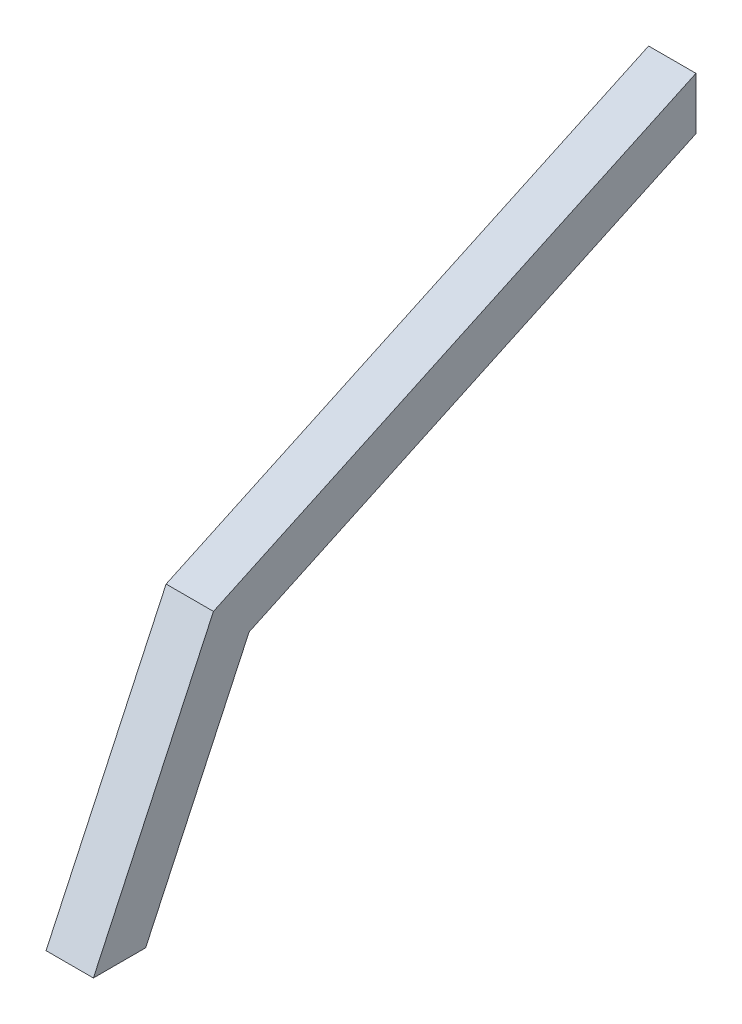
ISO-10303-21;
HEADER;
FILE_DESCRIPTION(('STEP AP214'),'2;1');
FILE_NAME('part.step','',(''),(''),'','','');
FILE_SCHEMA(('AUTOMOTIVE_DESIGN { 1 0 10303 214 1 1 1 1 }'));
ENDSEC;
DATA;
#1=APPLICATION_CONTEXT('core data for automotive mechanical design processes');
#2=APPLICATION_PROTOCOL_DEFINITION('international standard','automotive_design',2000,#1);
#3=PRODUCT_CONTEXT('',#1,'mechanical');
#4=PRODUCT('Part','Part','',(#3));
#5=PRODUCT_RELATED_PRODUCT_CATEGORY('part','',(#4));
#6=PRODUCT_DEFINITION_FORMATION('','',#4);
#7=PRODUCT_DEFINITION_CONTEXT('part definition',#1,'design');
#8=PRODUCT_DEFINITION('design','',#6,#7);
#9=PRODUCT_DEFINITION_SHAPE('','',#8);
#10=(LENGTH_UNIT() NAMED_UNIT(*) SI_UNIT(.MILLI.,.METRE.));
#11=(NAMED_UNIT(*) PLANE_ANGLE_UNIT() SI_UNIT($,.RADIAN.));
#12=(NAMED_UNIT(*) SI_UNIT($,.STERADIAN.) SOLID_ANGLE_UNIT());
#13=UNCERTAINTY_MEASURE_WITH_UNIT(LENGTH_MEASURE(1.E-05),#10,'distance_accuracy_value','');
#14=(GEOMETRIC_REPRESENTATION_CONTEXT(3) GLOBAL_UNCERTAINTY_ASSIGNED_CONTEXT((#13)) GLOBAL_UNIT_ASSIGNED_CONTEXT((#10,
#11,#12)) REPRESENTATION_CONTEXT('',''));
#15=CARTESIAN_POINT('',(0.,0.,0.));
#16=DIRECTION('',(0.,0.,1.));
#17=DIRECTION('',(1.,0.,0.));
#18=AXIS2_PLACEMENT_3D('',#15,#16,#17);
#19=CARTESIAN_POINT('',(20.,181.620135221068,-232.463172313984));
#20=DIRECTION('',(0.,0.,1.));
#21=DIRECTION('',(0.,-1.,0.));
#22=AXIS2_PLACEMENT_3D('',#19,#20,#21);
#23=PLANE('',#22);
#24=DIRECTION('',(0.,1.,0.));
#25=VECTOR('',#24,1.);
#26=CARTESIAN_POINT('',(0.,181.620135221068,-232.463172313984));
#27=LINE('',#26,#25);
#28=CARTESIAN_POINT('',(0.,181.620135221068,-232.463172313984));
#29=VERTEX_POINT('',#28);
#30=CARTESIAN_POINT('',(0.,203.682917329398,-232.463172313984));
#31=VERTEX_POINT('',#30);
#32=EDGE_CURVE('E234',#29,#31,#27,.T.);
#33=ORIENTED_EDGE('',*,*,#32,.T.);
#34=DIRECTION('',(-1.,0.,0.));
#35=VECTOR('',#34,1.);
#36=CARTESIAN_POINT('',(20.,203.682917329398,-232.463172313984));
#37=LINE('',#36,#35);
#38=CARTESIAN_POINT('',(20.,203.682917329398,-232.463172313984));
#39=VERTEX_POINT('',#38);
#40=EDGE_CURVE('E256',#39,#31,#37,.T.);
#41=ORIENTED_EDGE('',*,*,#40,.F.);
#42=DIRECTION('',(0.,1.,0.));
#43=VECTOR('',#42,1.);
#44=CARTESIAN_POINT('',(20.,181.620135221068,-232.463172313984));
#45=LINE('',#44,#43);
#46=CARTESIAN_POINT('',(20.,181.620135221068,-232.463172313984));
#47=VERTEX_POINT('',#46);
#48=EDGE_CURVE('E215',#47,#39,#45,.T.);
#49=ORIENTED_EDGE('',*,*,#48,.F.);
#50=DIRECTION('',(-1.,0.,0.));
#51=VECTOR('',#50,1.);
#52=CARTESIAN_POINT('',(20.,181.620135221068,-232.463172313984));
#53=LINE('',#52,#51);
#54=EDGE_CURVE('E54',#47,#29,#53,.T.);
#55=ORIENTED_EDGE('',*,*,#54,.T.);
#56=EDGE_LOOP('',(#33,#41,#49,#55));
#57=FACE_BOUND('',#56,.T.);
#58=DIRECTION('',(0.,1.,0.));
#59=VECTOR('',#58,1.);
#60=CARTESIAN_POINT('',(1.2,181.620135221068,-232.463172313984));
#61=LINE('',#60,#59);
#62=CARTESIAN_POINT('',(1.2,182.943902147568,-232.463172313984));
#63=VERTEX_POINT('',#62);
#64=CARTESIAN_POINT('',(1.2,202.359150402898,-232.463172313984));
#65=VERTEX_POINT('',#64);
#66=EDGE_CURVE('E147',#63,#65,#61,.T.);
#67=ORIENTED_EDGE('',*,*,#66,.F.);
#68=DIRECTION('',(-1.,0.,0.));
#69=VECTOR('',#68,1.);
#70=CARTESIAN_POINT('',(20.,182.943902147568,-232.463172313984));
#71=LINE('',#70,#69);
#72=CARTESIAN_POINT('',(18.8,182.943902147568,-232.463172313984));
#73=VERTEX_POINT('',#72);
#74=EDGE_CURVE('E142',#73,#63,#71,.T.);
#75=ORIENTED_EDGE('',*,*,#74,.F.);
#76=DIRECTION('',(0.,1.,0.));
#77=VECTOR('',#76,1.);
#78=CARTESIAN_POINT('',(18.8,181.620135221068,-232.463172313984));
#79=LINE('',#78,#77);
#80=CARTESIAN_POINT('',(18.8,202.359150402898,-232.463172313984));
#81=VERTEX_POINT('',#80);
#82=EDGE_CURVE('E61',#73,#81,#79,.T.);
#83=ORIENTED_EDGE('',*,*,#82,.T.);
#84=DIRECTION('',(-1.,0.,0.));
#85=VECTOR('',#84,1.);
#86=CARTESIAN_POINT('',(20.,202.359150402898,-232.463172313984));
#87=LINE('',#86,#85);
#88=EDGE_CURVE('E184',#81,#65,#87,.T.);
#89=ORIENTED_EDGE('',*,*,#88,.T.);
#90=EDGE_LOOP('',(#67,#75,#83,#89));
#91=FACE_BOUND('',#90,.T.);
#92=ADVANCED_FACE('F45',(#57,#91),#23,.F.);
#93=CARTESIAN_POINT('',(20.,0.,0.));
#94=DIRECTION('',(0.,1.,0.));
#95=DIRECTION('',(0.,0.,1.));
#96=AXIS2_PLACEMENT_3D('',#93,#94,#95);
#97=PLANE('',#96);
#98=DIRECTION('',(0.,0.,-1.));
#99=VECTOR('',#98,1.);
#100=CARTESIAN_POINT('',(0.,0.,0.));
#101=LINE('',#100,#99);
#102=CARTESIAN_POINT('',(0.,0.,22.0675583792499));
#103=VERTEX_POINT('',#102);
#104=CARTESIAN_POINT('',(0.,0.,0.));
#105=VERTEX_POINT('',#104);
#106=EDGE_CURVE('E212',#103,#105,#101,.T.);
#107=ORIENTED_EDGE('',*,*,#106,.T.);
#108=DIRECTION('',(-1.,0.,0.));
#109=VECTOR('',#108,1.);
#110=CARTESIAN_POINT('',(20.,0.,0.));
#111=LINE('',#110,#109);
#112=CARTESIAN_POINT('',(20.,0.,0.));
#113=VERTEX_POINT('',#112);
#114=EDGE_CURVE('E227',#113,#105,#111,.T.);
#115=ORIENTED_EDGE('',*,*,#114,.F.);
#116=DIRECTION('',(0.,0.,-1.));
#117=VECTOR('',#116,1.);
#118=CARTESIAN_POINT('',(20.,0.,0.));
#119=LINE('',#118,#117);
#120=CARTESIAN_POINT('',(20.,0.,22.0675583792499));
#121=VERTEX_POINT('',#120);
#122=EDGE_CURVE('E224',#121,#113,#119,.T.);
#123=ORIENTED_EDGE('',*,*,#122,.F.);
#124=DIRECTION('',(-1.,0.,0.));
#125=VECTOR('',#124,1.);
#126=CARTESIAN_POINT('',(20.,0.,22.0675583792499));
#127=LINE('',#126,#125);
#128=EDGE_CURVE('E248',#121,#103,#127,.T.);
#129=ORIENTED_EDGE('',*,*,#128,.T.);
#130=EDGE_LOOP('',(#107,#115,#123,#129));
#131=FACE_BOUND('',#130,.T.);
#132=DIRECTION('',(0.,0.,-1.));
#133=VECTOR('',#132,1.);
#134=CARTESIAN_POINT('',(1.2,0.,0.));
#135=LINE('',#134,#133);
#136=CARTESIAN_POINT('',(1.2,0.,20.7435048764949));
#137=VERTEX_POINT('',#136);
#138=CARTESIAN_POINT('',(1.2,0.,1.32405350275499));
#139=VERTEX_POINT('',#138);
#140=EDGE_CURVE('E161',#137,#139,#135,.T.);
#141=ORIENTED_EDGE('',*,*,#140,.F.);
#142=DIRECTION('',(-1.,0.,0.));
#143=VECTOR('',#142,1.);
#144=CARTESIAN_POINT('',(20.,0.,20.7435048764949));
#145=LINE('',#144,#143);
#146=CARTESIAN_POINT('',(18.8,0.,20.7435048764949));
#147=VERTEX_POINT('',#146);
#148=EDGE_CURVE('E185',#147,#137,#145,.T.);
#149=ORIENTED_EDGE('',*,*,#148,.F.);
#150=DIRECTION('',(0.,0.,-1.));
#151=VECTOR('',#150,1.);
#152=CARTESIAN_POINT('',(18.8,0.,0.));
#153=LINE('',#152,#151);
#154=CARTESIAN_POINT('',(18.8,0.,1.32405350275499));
#155=VERTEX_POINT('',#154);
#156=EDGE_CURVE('E68',#147,#155,#153,.T.);
#157=ORIENTED_EDGE('',*,*,#156,.T.);
#158=DIRECTION('',(-1.,0.,0.));
#159=VECTOR('',#158,1.);
#160=CARTESIAN_POINT('',(20.,0.,1.32405350275499));
#161=LINE('',#160,#159);
#162=EDGE_CURVE('E188',#155,#139,#161,.T.);
#163=ORIENTED_EDGE('',*,*,#162,.T.);
#164=EDGE_LOOP('',(#141,#149,#157,#163));
#165=FACE_BOUND('',#164,.T.);
#166=ADVANCED_FACE('F291',(#131,#165),#97,.F.);
#167=CARTESIAN_POINT('',(20.,0.,0.));
#168=DIRECTION('',(0.,0.422618261740704,0.906307787036648));
#169=DIRECTION('',(0.,-0.906307787036648,0.422618261740704));
#170=AXIS2_PLACEMENT_3D('',#167,#168,#169);
#171=PLANE('',#170);
#172=DIRECTION('',(0.,0.906307787036648,-0.422618261740704));
#173=VECTOR('',#172,1.);
#174=CARTESIAN_POINT('',(0.,0.,0.));
#175=LINE('',#174,#173);
#176=CARTESIAN_POINT('',(0.,93.702420310246,-43.6941561783267));
#177=VERTEX_POINT('',#176);
#178=EDGE_CURVE('E157',#105,#177,#175,.T.);
#179=ORIENTED_EDGE('',*,*,#178,.T.);
#180=DIRECTION('',(-1.,0.,0.));
#181=VECTOR('',#180,1.);
#182=CARTESIAN_POINT('',(20.,93.702420310246,-43.6941561783267));
#183=LINE('',#182,#181);
#184=CARTESIAN_POINT('',(20.,93.702420310246,-43.6941561783267));
#185=VERTEX_POINT('',#184);
#186=EDGE_CURVE('E11',#185,#177,#183,.T.);
#187=ORIENTED_EDGE('',*,*,#186,.F.);
#188=DIRECTION('',(0.,0.906307787036648,-0.422618261740704));
#189=VECTOR('',#188,1.);
#190=CARTESIAN_POINT('',(20.,0.,0.));
#191=LINE('',#190,#189);
#192=EDGE_CURVE('E207',#113,#185,#191,.T.);
#193=ORIENTED_EDGE('',*,*,#192,.F.);
#194=ORIENTED_EDGE('',*,*,#114,.T.);
#195=EDGE_LOOP('',(#179,#187,#193,#194));
#196=FACE_BOUND('',#195,.T.);
#197=ADVANCED_FACE('F47',(#196),#171,.F.);
#198=CARTESIAN_POINT('',(20.,93.702420310246,-43.6941561783267));
#199=DIRECTION('',(0.,0.906503989469603,0.422197249014834));
#200=DIRECTION('',(0.,-0.422197249014834,0.906503989469603));
#201=AXIS2_PLACEMENT_3D('',#198,#199,#200);
#202=PLANE('',#201);
#203=DIRECTION('',(0.,0.422197249014834,-0.906503989469603));
#204=VECTOR('',#203,1.);
#205=CARTESIAN_POINT('',(0.,93.702420310246,-43.6941561783267));
#206=LINE('',#205,#204);
#207=EDGE_CURVE('E231',#177,#29,#206,.T.);
#208=ORIENTED_EDGE('',*,*,#207,.T.);
#209=ORIENTED_EDGE('',*,*,#54,.F.);
#210=DIRECTION('',(0.,0.422197249014834,-0.906503989469603));
#211=VECTOR('',#210,1.);
#212=CARTESIAN_POINT('',(20.,93.702420310246,-43.6941561783267));
#213=LINE('',#212,#211);
#214=EDGE_CURVE('E211',#185,#47,#213,.T.);
#215=ORIENTED_EDGE('',*,*,#214,.F.);
#216=ORIENTED_EDGE('',*,*,#186,.T.);
#217=EDGE_LOOP('',(#208,#209,#215,#216));
#218=FACE_BOUND('',#217,.T.);
#219=ADVANCED_FACE('F288',(#218),#202,.F.);
#220=CARTESIAN_POINT('',(20.,108.756934444398,-28.6466330296346));
#221=DIRECTION('',(0.,-0.906503989469603,-0.422197249014834));
#222=DIRECTION('',(0.,0.422197249014834,-0.906503989469603));
#223=AXIS2_PLACEMENT_3D('',#220,#221,#222);
#224=PLANE('',#223);
#225=DIRECTION('',(0.,-0.422197249014834,0.906503989469603));
#226=VECTOR('',#225,1.);
#227=CARTESIAN_POINT('',(0.,108.756934444398,-28.6466330296346));
#228=LINE('',#227,#226);
#229=CARTESIAN_POINT('',(0.,108.756934444398,-28.6466330296346));
#230=VERTEX_POINT('',#229);
#231=EDGE_CURVE('E237',#31,#230,#228,.T.);
#232=ORIENTED_EDGE('',*,*,#231,.T.);
#233=DIRECTION('',(-1.,0.,0.));
#234=VECTOR('',#233,1.);
#235=CARTESIAN_POINT('',(20.,108.756934444398,-28.6466330296346));
#236=LINE('',#235,#234);
#237=CARTESIAN_POINT('',(20.,108.756934444398,-28.6466330296346));
#238=VERTEX_POINT('',#237);
#239=EDGE_CURVE('E252',#238,#230,#236,.T.);
#240=ORIENTED_EDGE('',*,*,#239,.F.);
#241=DIRECTION('',(0.,-0.422197249014834,0.906503989469603));
#242=VECTOR('',#241,1.);
#243=CARTESIAN_POINT('',(20.,108.756934444398,-28.6466330296346));
#244=LINE('',#243,#242);
#245=EDGE_CURVE('E218',#39,#238,#244,.T.);
#246=ORIENTED_EDGE('',*,*,#245,.F.);
#247=ORIENTED_EDGE('',*,*,#40,.T.);
#248=EDGE_LOOP('',(#232,#240,#246,#247));
#249=FACE_BOUND('',#248,.T.);
#250=ADVANCED_FACE('F276',(#249),#224,.F.);
#251=CARTESIAN_POINT('',(20.,0.,22.0675583792499));
#252=DIRECTION('',(0.,-0.422618261740704,-0.906307787036648));
#253=DIRECTION('',(0.,0.906307787036648,-0.422618261740704));
#254=AXIS2_PLACEMENT_3D('',#251,#252,#253);
#255=PLANE('',#254);
#256=DIRECTION('',(0.,-0.906307787036648,0.422618261740704));
#257=VECTOR('',#256,1.);
#258=CARTESIAN_POINT('',(0.,0.,22.0675583792499));
#259=LINE('',#258,#257);
#260=EDGE_CURVE('E240',#230,#103,#259,.T.);
#261=ORIENTED_EDGE('',*,*,#260,.T.);
#262=ORIENTED_EDGE('',*,*,#128,.F.);
#263=DIRECTION('',(0.,-0.906307787036648,0.422618261740704));
#264=VECTOR('',#263,1.);
#265=CARTESIAN_POINT('',(20.,0.,22.0675583792499));
#266=LINE('',#265,#264);
#267=EDGE_CURVE('E221',#238,#121,#266,.T.);
#268=ORIENTED_EDGE('',*,*,#267,.F.);
#269=ORIENTED_EDGE('',*,*,#239,.T.);
#270=EDGE_LOOP('',(#261,#262,#268,#269));
#271=FACE_BOUND('',#270,.T.);
#272=ADVANCED_FACE('F280',(#271),#255,.F.);
#273=CARTESIAN_POINT('',(20.,0.,0.));
#274=DIRECTION('',(1.,0.,0.));
#275=DIRECTION('',(0.,0.,-1.));
#276=AXIS2_PLACEMENT_3D('',#273,#274,#275);
#277=PLANE('',#276);
#278=ORIENTED_EDGE('',*,*,#192,.T.);
#279=ORIENTED_EDGE('',*,*,#214,.T.);
#280=ORIENTED_EDGE('',*,*,#48,.T.);
#281=ORIENTED_EDGE('',*,*,#245,.T.);
#282=ORIENTED_EDGE('',*,*,#267,.T.);
#283=ORIENTED_EDGE('',*,*,#122,.T.);
#284=EDGE_LOOP('',(#278,#279,#280,#281,#282,#283));
#285=FACE_BOUND('',#284,.T.);
#286=ADVANCED_FACE('F284',(#285),#277,.T.);
#287=CARTESIAN_POINT('',(0.,0.,0.));
#288=DIRECTION('',(1.,0.,0.));
#289=DIRECTION('',(0.,0.,-1.));
#290=AXIS2_PLACEMENT_3D('',#287,#288,#289);
#291=PLANE('',#290);
#292=ORIENTED_EDGE('',*,*,#178,.F.);
#293=ORIENTED_EDGE('',*,*,#106,.F.);
#294=ORIENTED_EDGE('',*,*,#260,.F.);
#295=ORIENTED_EDGE('',*,*,#231,.F.);
#296=ORIENTED_EDGE('',*,*,#32,.F.);
#297=ORIENTED_EDGE('',*,*,#207,.F.);
#298=EDGE_LOOP('',(#292,#293,#294,#295,#296,#297));
#299=FACE_BOUND('',#298,.T.);
#300=ADVANCED_FACE('F271',(#299),#291,.F.);
#301=CARTESIAN_POINT('',(20.,0.507141914088844,1.08756934444398));
#302=DIRECTION('',(0.,0.422618261740704,0.906307787036648));
#303=DIRECTION('',(0.,-0.906307787036648,0.422618261740704));
#304=AXIS2_PLACEMENT_3D('',#301,#302,#303);
#305=PLANE('',#304);
#306=DIRECTION('',(0.,0.906307787036648,-0.422618261740704));
#307=VECTOR('',#306,1.);
#308=CARTESIAN_POINT('',(1.2,0.507141914088844,1.08756934444398));
#309=LINE('',#308,#307);
#310=CARTESIAN_POINT('',(1.2,94.6056911582951,-42.7913047894052));
#311=VERTEX_POINT('',#310);
#312=EDGE_CURVE('E148',#139,#311,#309,.T.);
#313=ORIENTED_EDGE('',*,*,#312,.F.);
#314=ORIENTED_EDGE('',*,*,#162,.F.);
#315=DIRECTION('',(0.,0.906307787036648,-0.422618261740704));
#316=VECTOR('',#315,1.);
#317=CARTESIAN_POINT('',(18.8,0.507141914088844,1.08756934444398));
#318=LINE('',#317,#316);
#319=CARTESIAN_POINT('',(18.8,94.6056911582951,-42.7913047894052));
#320=VERTEX_POINT('',#319);
#321=EDGE_CURVE('E155',#155,#320,#318,.T.);
#322=ORIENTED_EDGE('',*,*,#321,.T.);
#323=DIRECTION('',(-1.,0.,0.));
#324=VECTOR('',#323,1.);
#325=CARTESIAN_POINT('',(20.,94.6056911582951,-42.7913047894052));
#326=LINE('',#325,#324);
#327=EDGE_CURVE('E140',#320,#311,#326,.T.);
#328=ORIENTED_EDGE('',*,*,#327,.T.);
#329=EDGE_LOOP('',(#313,#314,#322,#328));
#330=FACE_BOUND('',#329,.T.);
#331=ADVANCED_FACE('F153',(#330),#305,.T.);
#332=CARTESIAN_POINT('',(20.,94.7902250976095,-43.1875194795089));
#333=DIRECTION('',(0.,0.906503989469603,0.422197249014834));
#334=DIRECTION('',(0.,-0.422197249014834,0.906503989469603));
#335=AXIS2_PLACEMENT_3D('',#332,#333,#334);
#336=PLANE('',#335);
#337=DIRECTION('',(0.,0.422197249014834,-0.906503989469603));
#338=VECTOR('',#337,1.);
#339=CARTESIAN_POINT('',(1.2,94.7902250976095,-43.1875194795089));
#340=LINE('',#339,#338);
#341=EDGE_CURVE('E137',#311,#63,#340,.T.);
#342=ORIENTED_EDGE('',*,*,#341,.F.);
#343=ORIENTED_EDGE('',*,*,#327,.F.);
#344=DIRECTION('',(0.,0.422197249014834,-0.906503989469603));
#345=VECTOR('',#344,1.);
#346=CARTESIAN_POINT('',(18.8,94.7902250976095,-43.1875194795089));
#347=LINE('',#346,#345);
#348=EDGE_CURVE('E166',#320,#73,#347,.T.);
#349=ORIENTED_EDGE('',*,*,#348,.T.);
#350=ORIENTED_EDGE('',*,*,#74,.T.);
#351=EDGE_LOOP('',(#342,#343,#349,#350));
#352=FACE_BOUND('',#351,.T.);
#353=ADVANCED_FACE('F139',(#352),#336,.T.);
#354=CARTESIAN_POINT('',(20.,107.669129657034,-29.1532697284524));
#355=DIRECTION('',(0.,-0.906503989469603,-0.422197249014834));
#356=DIRECTION('',(0.,0.422197249014834,-0.906503989469603));
#357=AXIS2_PLACEMENT_3D('',#354,#355,#356);
#358=PLANE('',#357);
#359=DIRECTION('',(0.,-0.422197249014834,0.906503989469603));
#360=VECTOR('',#359,1.);
#361=CARTESIAN_POINT('',(1.2,107.669129657034,-29.1532697284524));
#362=LINE('',#361,#360);
#363=CARTESIAN_POINT('',(1.2,107.853663596349,-29.5494844185561));
#364=VERTEX_POINT('',#363);
#365=EDGE_CURVE('E176',#65,#364,#362,.T.);
#366=ORIENTED_EDGE('',*,*,#365,.F.);
#367=ORIENTED_EDGE('',*,*,#88,.F.);
#368=DIRECTION('',(0.,-0.422197249014834,0.906503989469603));
#369=VECTOR('',#368,1.);
#370=CARTESIAN_POINT('',(18.8,107.669129657034,-29.1532697284524));
#371=LINE('',#370,#369);
#372=CARTESIAN_POINT('',(18.8,107.853663596349,-29.5494844185561));
#373=VERTEX_POINT('',#372);
#374=EDGE_CURVE('E170',#81,#373,#371,.T.);
#375=ORIENTED_EDGE('',*,*,#374,.T.);
#376=DIRECTION('',(-1.,0.,0.));
#377=VECTOR('',#376,1.);
#378=CARTESIAN_POINT('',(20.,107.853663596349,-29.5494844185561));
#379=LINE('',#378,#377);
#380=EDGE_CURVE('E180',#373,#364,#379,.T.);
#381=ORIENTED_EDGE('',*,*,#380,.T.);
#382=EDGE_LOOP('',(#366,#367,#375,#381));
#383=FACE_BOUND('',#382,.T.);
#384=ADVANCED_FACE('F299',(#383),#358,.T.);
#385=CARTESIAN_POINT('',(20.,-0.507141914088847,20.9799890348059));
#386=DIRECTION('',(0.,-0.422618261740704,-0.906307787036648));
#387=DIRECTION('',(0.,0.906307787036648,-0.422618261740704));
#388=AXIS2_PLACEMENT_3D('',#385,#386,#387);
#389=PLANE('',#388);
#390=DIRECTION('',(0.,-0.906307787036648,0.422618261740704));
#391=VECTOR('',#390,1.);
#392=CARTESIAN_POINT('',(1.2,-0.507141914088847,20.9799890348059));
#393=LINE('',#392,#391);
#394=EDGE_CURVE('E179',#364,#137,#393,.T.);
#395=ORIENTED_EDGE('',*,*,#394,.F.);
#396=ORIENTED_EDGE('',*,*,#380,.F.);
#397=DIRECTION('',(0.,-0.906307787036648,0.422618261740704));
#398=VECTOR('',#397,1.);
#399=CARTESIAN_POINT('',(18.8,-0.507141914088847,20.9799890348059));
#400=LINE('',#399,#398);
#401=EDGE_CURVE('E173',#373,#147,#400,.T.);
#402=ORIENTED_EDGE('',*,*,#401,.T.);
#403=ORIENTED_EDGE('',*,*,#148,.T.);
#404=EDGE_LOOP('',(#395,#396,#402,#403));
#405=FACE_BOUND('',#404,.T.);
#406=ADVANCED_FACE('F303',(#405),#389,.T.);
#407=CARTESIAN_POINT('',(18.8,0.,0.));
#408=DIRECTION('',(1.,0.,0.));
#409=DIRECTION('',(0.,0.,-1.));
#410=AXIS2_PLACEMENT_3D('',#407,#408,#409);
#411=PLANE('',#410);
#412=ORIENTED_EDGE('',*,*,#321,.F.);
#413=ORIENTED_EDGE('',*,*,#156,.F.);
#414=ORIENTED_EDGE('',*,*,#401,.F.);
#415=ORIENTED_EDGE('',*,*,#374,.F.);
#416=ORIENTED_EDGE('',*,*,#82,.F.);
#417=ORIENTED_EDGE('',*,*,#348,.F.);
#418=EDGE_LOOP('',(#412,#413,#414,#415,#416,#417));
#419=FACE_BOUND('',#418,.T.);
#420=ADVANCED_FACE('F296',(#419),#411,.F.);
#421=CARTESIAN_POINT('',(1.2,0.,0.));
#422=DIRECTION('',(1.,0.,0.));
#423=DIRECTION('',(0.,0.,-1.));
#424=AXIS2_PLACEMENT_3D('',#421,#422,#423);
#425=PLANE('',#424);
#426=ORIENTED_EDGE('',*,*,#312,.T.);
#427=ORIENTED_EDGE('',*,*,#341,.T.);
#428=ORIENTED_EDGE('',*,*,#66,.T.);
#429=ORIENTED_EDGE('',*,*,#365,.T.);
#430=ORIENTED_EDGE('',*,*,#394,.T.);
#431=ORIENTED_EDGE('',*,*,#140,.T.);
#432=EDGE_LOOP('',(#426,#427,#428,#429,#430,#431));
#433=FACE_BOUND('',#432,.T.);
#434=ADVANCED_FACE('F159',(#433),#425,.T.);
#435=CLOSED_SHELL('',(#92,#166,#197,#219,#250,#272,#286,#300,#331,#353,#384,#406,#420,#434));
#436=MANIFOLD_SOLID_BREP('B2',#435);
#437=ADVANCED_BREP_SHAPE_REPRESENTATION('',(#18,#436),#14);
#438=SHAPE_DEFINITION_REPRESENTATION(#9,#437);
ENDSEC;
END-ISO-10303-21;
